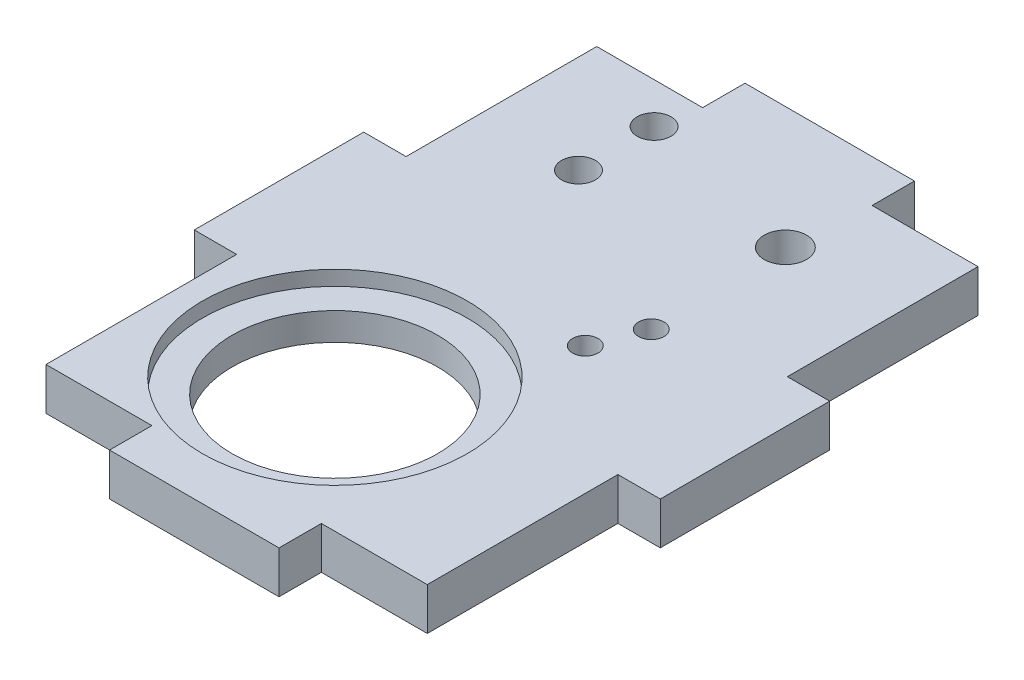
ISO-10303-21;
HEADER;
FILE_DESCRIPTION(('STEP AP214'),'2;1');
FILE_NAME('part.step','',(''),(''),'','','');
FILE_SCHEMA(('AUTOMOTIVE_DESIGN { 1 0 10303 214 1 1 1 1 }'));
ENDSEC;
DATA;
#1=APPLICATION_CONTEXT('core data for automotive mechanical design processes');
#2=APPLICATION_PROTOCOL_DEFINITION('international standard','automotive_design',2000,#1);
#3=PRODUCT_CONTEXT('',#1,'mechanical');
#4=PRODUCT('Part','Part','',(#3));
#5=PRODUCT_RELATED_PRODUCT_CATEGORY('part','',(#4));
#6=PRODUCT_DEFINITION_FORMATION('','',#4);
#7=PRODUCT_DEFINITION_CONTEXT('part definition',#1,'design');
#8=PRODUCT_DEFINITION('design','',#6,#7);
#9=PRODUCT_DEFINITION_SHAPE('','',#8);
#10=(LENGTH_UNIT() NAMED_UNIT(*) SI_UNIT(.MILLI.,.METRE.));
#11=(NAMED_UNIT(*) PLANE_ANGLE_UNIT() SI_UNIT($,.RADIAN.));
#12=(NAMED_UNIT(*) SI_UNIT($,.STERADIAN.) SOLID_ANGLE_UNIT());
#13=UNCERTAINTY_MEASURE_WITH_UNIT(LENGTH_MEASURE(1.E-05),#10,'distance_accuracy_value','');
#14=(GEOMETRIC_REPRESENTATION_CONTEXT(3) GLOBAL_UNCERTAINTY_ASSIGNED_CONTEXT((#13)) GLOBAL_UNIT_ASSIGNED_CONTEXT((#10,
#11,#12)) REPRESENTATION_CONTEXT('',''));
#15=CARTESIAN_POINT('',(0.,0.,0.));
#16=DIRECTION('',(0.,0.,1.));
#17=DIRECTION('',(1.,0.,0.));
#18=AXIS2_PLACEMENT_3D('',#15,#16,#17);
#19=CARTESIAN_POINT('',(0.,10.,0.));
#20=DIRECTION('',(-1.,0.,0.));
#21=DIRECTION('',(0.,0.,1.));
#22=AXIS2_PLACEMENT_3D('',#19,#20,#21);
#23=PLANE('',#22);
#24=DIRECTION('',(0.,0.,-1.));
#25=VECTOR('',#24,1.);
#26=CARTESIAN_POINT('',(0.,0.,0.));
#27=LINE('',#26,#25);
#28=CARTESIAN_POINT('',(0.,0.,0.));
#29=VERTEX_POINT('',#28);
#30=CARTESIAN_POINT('',(0.,0.,-45.));
#31=VERTEX_POINT('',#30);
#32=EDGE_CURVE('E195',#29,#31,#27,.T.);
#33=ORIENTED_EDGE('',*,*,#32,.F.);
#34=DIRECTION('',(0.,-1.,0.));
#35=VECTOR('',#34,1.);
#36=CARTESIAN_POINT('',(0.,10.,0.));
#37=LINE('',#36,#35);
#38=CARTESIAN_POINT('',(0.,10.,0.));
#39=VERTEX_POINT('',#38);
#40=EDGE_CURVE('E205',#39,#29,#37,.T.);
#41=ORIENTED_EDGE('',*,*,#40,.F.);
#42=DIRECTION('',(0.,0.,-1.));
#43=VECTOR('',#42,1.);
#44=CARTESIAN_POINT('',(0.,10.,0.));
#45=LINE('',#44,#43);
#46=CARTESIAN_POINT('',(0.,10.,-45.));
#47=VERTEX_POINT('',#46);
#48=EDGE_CURVE('E154',#39,#47,#45,.T.);
#49=ORIENTED_EDGE('',*,*,#48,.T.);
#50=DIRECTION('',(0.,-1.,0.));
#51=VECTOR('',#50,1.);
#52=CARTESIAN_POINT('',(0.,10.,-45.));
#53=LINE('',#52,#51);
#54=EDGE_CURVE('E208',#47,#31,#53,.T.);
#55=ORIENTED_EDGE('',*,*,#54,.T.);
#56=EDGE_LOOP('',(#33,#41,#49,#55));
#57=FACE_BOUND('',#56,.T.);
#58=ADVANCED_FACE('F41',(#57),#23,.T.);
#59=CARTESIAN_POINT('',(0.,10.,-45.));
#60=DIRECTION('',(0.,0.,1.));
#61=DIRECTION('',(1.,0.,0.));
#62=AXIS2_PLACEMENT_3D('',#59,#60,#61);
#63=PLANE('',#62);
#64=DIRECTION('',(-1.,0.,0.));
#65=VECTOR('',#64,1.);
#66=CARTESIAN_POINT('',(0.,0.,-45.));
#67=LINE('',#66,#65);
#68=CARTESIAN_POINT('',(-9.99999999999999,0.,-45.));
#69=VERTEX_POINT('',#68);
#70=EDGE_CURVE('E202',#31,#69,#67,.T.);
#71=ORIENTED_EDGE('',*,*,#70,.F.);
#72=ORIENTED_EDGE('',*,*,#54,.F.);
#73=DIRECTION('',(-1.,0.,0.));
#74=VECTOR('',#73,1.);
#75=CARTESIAN_POINT('',(0.,10.,-45.));
#76=LINE('',#75,#74);
#77=CARTESIAN_POINT('',(-9.99999999999999,10.,-45.));
#78=VERTEX_POINT('',#77);
#79=EDGE_CURVE('E161',#47,#78,#76,.T.);
#80=ORIENTED_EDGE('',*,*,#79,.T.);
#81=DIRECTION('',(0.,-1.,0.));
#82=VECTOR('',#81,1.);
#83=CARTESIAN_POINT('',(-9.99999999999999,10.,-45.));
#84=LINE('',#83,#82);
#85=EDGE_CURVE('E211',#78,#69,#84,.T.);
#86=ORIENTED_EDGE('',*,*,#85,.T.);
#87=EDGE_LOOP('',(#71,#72,#80,#86));
#88=FACE_BOUND('',#87,.T.);
#89=ADVANCED_FACE('F392',(#88),#63,.T.);
#90=CARTESIAN_POINT('',(-9.99999999999999,10.,0.));
#91=DIRECTION('',(1.,0.,0.));
#92=DIRECTION('',(0.,0.,-1.));
#93=AXIS2_PLACEMENT_3D('',#90,#91,#92);
#94=PLANE('',#93);
#95=DIRECTION('',(0.,0.,1.));
#96=VECTOR('',#95,1.);
#97=CARTESIAN_POINT('',(-9.99999999999999,0.,0.));
#98=LINE('',#97,#96);
#99=CARTESIAN_POINT('',(-9.99999999999999,0.,-85.));
#100=VERTEX_POINT('',#99);
#101=EDGE_CURVE('E198',#100,#69,#98,.T.);
#102=ORIENTED_EDGE('',*,*,#101,.T.);
#103=ORIENTED_EDGE('',*,*,#85,.F.);
#104=DIRECTION('',(0.,0.,1.));
#105=VECTOR('',#104,1.);
#106=CARTESIAN_POINT('',(-9.99999999999999,10.,0.));
#107=LINE('',#106,#105);
#108=CARTESIAN_POINT('',(-9.99999999999999,10.,-85.));
#109=VERTEX_POINT('',#108);
#110=EDGE_CURVE('E157',#109,#78,#107,.T.);
#111=ORIENTED_EDGE('',*,*,#110,.F.);
#112=DIRECTION('',(0.,-1.,0.));
#113=VECTOR('',#112,1.);
#114=CARTESIAN_POINT('',(-9.99999999999999,10.,-85.));
#115=LINE('',#114,#113);
#116=EDGE_CURVE('E214',#109,#100,#115,.T.);
#117=ORIENTED_EDGE('',*,*,#116,.T.);
#118=EDGE_LOOP('',(#102,#103,#111,#117));
#119=FACE_BOUND('',#118,.T.);
#120=ADVANCED_FACE('F399',(#119),#94,.F.);
#121=CARTESIAN_POINT('',(1.17961196366423E-13,10.,-85.));
#122=DIRECTION('',(0.,0.,1.));
#123=DIRECTION('',(1.,0.,0.));
#124=AXIS2_PLACEMENT_3D('',#121,#122,#123);
#125=PLANE('',#124);
#126=DIRECTION('',(-1.,0.,0.));
#127=VECTOR('',#126,1.);
#128=CARTESIAN_POINT('',(1.17961196366423E-13,0.,-85.));
#129=LINE('',#128,#127);
#130=CARTESIAN_POINT('',(0.,0.,-85.));
#131=VERTEX_POINT('',#130);
#132=EDGE_CURVE('E194',#131,#100,#129,.T.);
#133=ORIENTED_EDGE('',*,*,#132,.T.);
#134=ORIENTED_EDGE('',*,*,#116,.F.);
#135=DIRECTION('',(-1.,0.,0.));
#136=VECTOR('',#135,1.);
#137=CARTESIAN_POINT('',(1.17961196366423E-13,10.,-85.));
#138=LINE('',#137,#136);
#139=CARTESIAN_POINT('',(0.,10.,-85.));
#140=VERTEX_POINT('',#139);
#141=EDGE_CURVE('E153',#140,#109,#138,.T.);
#142=ORIENTED_EDGE('',*,*,#141,.F.);
#143=DIRECTION('',(0.,-1.,0.));
#144=VECTOR('',#143,1.);
#145=CARTESIAN_POINT('',(0.,10.,-85.));
#146=LINE('',#145,#144);
#147=EDGE_CURVE('E217',#140,#131,#146,.T.);
#148=ORIENTED_EDGE('',*,*,#147,.T.);
#149=EDGE_LOOP('',(#133,#134,#142,#148));
#150=FACE_BOUND('',#149,.T.);
#151=ADVANCED_FACE('F418',(#150),#125,.F.);
#152=CARTESIAN_POINT('',(1.17961196366423E-13,10.,-85.0000000000001));
#153=DIRECTION('',(0.,0.,-1.));
#154=DIRECTION('',(-1.,0.,0.));
#155=AXIS2_PLACEMENT_3D('',#152,#153,#154);
#156=PLANE('',#155);
#157=DIRECTION('',(1.,0.,0.));
#158=VECTOR('',#157,1.);
#159=CARTESIAN_POINT('',(1.17961196366423E-13,0.,-85.0000000000001));
#160=LINE('',#159,#158);
#161=CARTESIAN_POINT('',(90.,0.,-85.));
#162=VERTEX_POINT('',#161);
#163=CARTESIAN_POINT('',(100.,0.,-85.));
#164=VERTEX_POINT('',#163);
#165=EDGE_CURVE('E184',#162,#164,#160,.T.);
#166=ORIENTED_EDGE('',*,*,#165,.F.);
#167=DIRECTION('',(0.,-1.,0.));
#168=VECTOR('',#167,1.);
#169=CARTESIAN_POINT('',(90.,10.,-85.));
#170=LINE('',#169,#168);
#171=CARTESIAN_POINT('',(90.,10.,-85.));
#172=VERTEX_POINT('',#171);
#173=EDGE_CURVE('E225',#172,#162,#170,.T.);
#174=ORIENTED_EDGE('',*,*,#173,.F.);
#175=DIRECTION('',(1.,0.,0.));
#176=VECTOR('',#175,1.);
#177=CARTESIAN_POINT('',(1.17961196366423E-13,10.,-85.0000000000001));
#178=LINE('',#177,#176);
#179=CARTESIAN_POINT('',(100.,10.,-85.));
#180=VERTEX_POINT('',#179);
#181=EDGE_CURVE('E145',#172,#180,#178,.T.);
#182=ORIENTED_EDGE('',*,*,#181,.T.);
#183=DIRECTION('',(0.,-1.,0.));
#184=VECTOR('',#183,1.);
#185=CARTESIAN_POINT('',(100.,10.,-85.));
#186=LINE('',#185,#184);
#187=EDGE_CURVE('E229',#180,#164,#186,.T.);
#188=ORIENTED_EDGE('',*,*,#187,.T.);
#189=EDGE_LOOP('',(#166,#174,#182,#188));
#190=FACE_BOUND('',#189,.T.);
#191=ADVANCED_FACE('F310',(#190),#156,.T.);
#192=CARTESIAN_POINT('',(100.,10.,0.));
#193=DIRECTION('',(1.,0.,0.));
#194=DIRECTION('',(0.,0.,-1.));
#195=AXIS2_PLACEMENT_3D('',#192,#193,#194);
#196=PLANE('',#195);
#197=DIRECTION('',(0.,0.,1.));
#198=VECTOR('',#197,1.);
#199=CARTESIAN_POINT('',(100.,0.,0.));
#200=LINE('',#199,#198);
#201=CARTESIAN_POINT('',(100.,0.,-45.));
#202=VERTEX_POINT('',#201);
#203=EDGE_CURVE('E181',#164,#202,#200,.T.);
#204=ORIENTED_EDGE('',*,*,#203,.F.);
#205=ORIENTED_EDGE('',*,*,#187,.F.);
#206=DIRECTION('',(0.,0.,1.));
#207=VECTOR('',#206,1.);
#208=CARTESIAN_POINT('',(100.,10.,0.));
#209=LINE('',#208,#207);
#210=CARTESIAN_POINT('',(100.,10.,-45.));
#211=VERTEX_POINT('',#210);
#212=EDGE_CURVE('E291',#180,#211,#209,.T.);
#213=ORIENTED_EDGE('',*,*,#212,.T.);
#214=DIRECTION('',(0.,-1.,0.));
#215=VECTOR('',#214,1.);
#216=CARTESIAN_POINT('',(100.,10.,-45.));
#217=LINE('',#216,#215);
#218=EDGE_CURVE('E233',#211,#202,#217,.T.);
#219=ORIENTED_EDGE('',*,*,#218,.T.);
#220=EDGE_LOOP('',(#204,#205,#213,#219));
#221=FACE_BOUND('',#220,.T.);
#222=ADVANCED_FACE('F373',(#221),#196,.T.);
#223=CARTESIAN_POINT('',(0.,10.,-45.));
#224=DIRECTION('',(0.,0.,-1.));
#225=DIRECTION('',(-1.,0.,0.));
#226=AXIS2_PLACEMENT_3D('',#223,#224,#225);
#227=PLANE('',#226);
#228=DIRECTION('',(1.,0.,0.));
#229=VECTOR('',#228,1.);
#230=CARTESIAN_POINT('',(0.,0.,-45.));
#231=LINE('',#230,#229);
#232=CARTESIAN_POINT('',(90.,0.,-45.));
#233=VERTEX_POINT('',#232);
#234=EDGE_CURVE('E177',#233,#202,#231,.T.);
#235=ORIENTED_EDGE('',*,*,#234,.T.);
#236=ORIENTED_EDGE('',*,*,#218,.F.);
#237=DIRECTION('',(1.,0.,0.));
#238=VECTOR('',#237,1.);
#239=CARTESIAN_POINT('',(0.,10.,-45.));
#240=LINE('',#239,#238);
#241=CARTESIAN_POINT('',(90.,10.,-45.));
#242=VERTEX_POINT('',#241);
#243=EDGE_CURVE('E289',#242,#211,#240,.T.);
#244=ORIENTED_EDGE('',*,*,#243,.F.);
#245=DIRECTION('',(0.,-1.,0.));
#246=VECTOR('',#245,1.);
#247=CARTESIAN_POINT('',(90.,10.,-45.));
#248=LINE('',#247,#246);
#249=EDGE_CURVE('E236',#242,#233,#248,.T.);
#250=ORIENTED_EDGE('',*,*,#249,.T.);
#251=EDGE_LOOP('',(#235,#236,#244,#250));
#252=FACE_BOUND('',#251,.T.);
#253=ADVANCED_FACE('F372',(#252),#227,.F.);
#254=CARTESIAN_POINT('',(90.,10.,0.));
#255=DIRECTION('',(-1.,0.,0.));
#256=DIRECTION('',(0.,0.,1.));
#257=AXIS2_PLACEMENT_3D('',#254,#255,#256);
#258=PLANE('',#257);
#259=DIRECTION('',(0.,0.,-1.));
#260=VECTOR('',#259,1.);
#261=CARTESIAN_POINT('',(90.,0.,0.));
#262=LINE('',#261,#260);
#263=CARTESIAN_POINT('',(90.,0.,0.));
#264=VERTEX_POINT('',#263);
#265=EDGE_CURVE('E174',#264,#233,#262,.T.);
#266=ORIENTED_EDGE('',*,*,#265,.T.);
#267=ORIENTED_EDGE('',*,*,#249,.F.);
#268=DIRECTION('',(0.,0.,-1.));
#269=VECTOR('',#268,1.);
#270=CARTESIAN_POINT('',(90.,10.,0.));
#271=LINE('',#270,#269);
#272=CARTESIAN_POINT('',(90.,10.,0.));
#273=VERTEX_POINT('',#272);
#274=EDGE_CURVE('E147',#273,#242,#271,.T.);
#275=ORIENTED_EDGE('',*,*,#274,.F.);
#276=DIRECTION('',(0.,-1.,0.));
#277=VECTOR('',#276,1.);
#278=CARTESIAN_POINT('',(90.,10.,0.));
#279=LINE('',#278,#277);
#280=EDGE_CURVE('E239',#273,#264,#279,.T.);
#281=ORIENTED_EDGE('',*,*,#280,.T.);
#282=EDGE_LOOP('',(#266,#267,#275,#281));
#283=FACE_BOUND('',#282,.T.);
#284=ADVANCED_FACE('F280',(#283),#258,.F.);
#285=CARTESIAN_POINT('',(0.,10.,0.));
#286=DIRECTION('',(0.,0.,-1.));
#287=DIRECTION('',(-1.,0.,0.));
#288=AXIS2_PLACEMENT_3D('',#285,#286,#287);
#289=PLANE('',#288);
#290=DIRECTION('',(1.,0.,0.));
#291=VECTOR('',#290,1.);
#292=CARTESIAN_POINT('',(0.,0.,0.));
#293=LINE('',#292,#291);
#294=CARTESIAN_POINT('',(65.,0.,0.));
#295=VERTEX_POINT('',#294);
#296=EDGE_CURVE('E166',#295,#264,#293,.T.);
#297=ORIENTED_EDGE('',*,*,#296,.T.);
#298=ORIENTED_EDGE('',*,*,#280,.F.);
#299=DIRECTION('',(1.,0.,0.));
#300=VECTOR('',#299,1.);
#301=CARTESIAN_POINT('',(0.,10.,0.));
#302=LINE('',#301,#300);
#303=CARTESIAN_POINT('',(65.,10.,0.));
#304=VERTEX_POINT('',#303);
#305=EDGE_CURVE('E290',#304,#273,#302,.T.);
#306=ORIENTED_EDGE('',*,*,#305,.F.);
#307=DIRECTION('',(0.,-1.,0.));
#308=VECTOR('',#307,1.);
#309=CARTESIAN_POINT('',(65.,10.,0.));
#310=LINE('',#309,#308);
#311=EDGE_CURVE('E242',#304,#295,#310,.T.);
#312=ORIENTED_EDGE('',*,*,#311,.T.);
#313=EDGE_LOOP('',(#297,#298,#306,#312));
#314=FACE_BOUND('',#313,.T.);
#315=ADVANCED_FACE('F273',(#314),#289,.F.);
#316=CARTESIAN_POINT('',(65.,10.,0.));
#317=DIRECTION('',(1.,0.,0.));
#318=DIRECTION('',(0.,0.,-1.));
#319=AXIS2_PLACEMENT_3D('',#316,#317,#318);
#320=PLANE('',#319);
#321=DIRECTION('',(0.,0.,1.));
#322=VECTOR('',#321,1.);
#323=CARTESIAN_POINT('',(65.,0.,0.));
#324=LINE('',#323,#322);
#325=CARTESIAN_POINT('',(65.,0.,10.));
#326=VERTEX_POINT('',#325);
#327=EDGE_CURVE('E171',#295,#326,#324,.T.);
#328=ORIENTED_EDGE('',*,*,#327,.F.);
#329=ORIENTED_EDGE('',*,*,#311,.F.);
#330=DIRECTION('',(0.,0.,1.));
#331=VECTOR('',#330,1.);
#332=CARTESIAN_POINT('',(65.,10.,0.));
#333=LINE('',#332,#331);
#334=CARTESIAN_POINT('',(65.,10.,10.));
#335=VERTEX_POINT('',#334);
#336=EDGE_CURVE('E256',#304,#335,#333,.T.);
#337=ORIENTED_EDGE('',*,*,#336,.T.);
#338=DIRECTION('',(0.,-1.,0.));
#339=VECTOR('',#338,1.);
#340=CARTESIAN_POINT('',(65.,10.,10.));
#341=LINE('',#340,#339);
#342=EDGE_CURVE('E122',#335,#326,#341,.T.);
#343=ORIENTED_EDGE('',*,*,#342,.T.);
#344=EDGE_LOOP('',(#328,#329,#337,#343));
#345=FACE_BOUND('',#344,.T.);
#346=ADVANCED_FACE('F251',(#345),#320,.T.);
#347=CARTESIAN_POINT('',(0.,10.,10.));
#348=DIRECTION('',(0.,0.,1.));
#349=DIRECTION('',(1.,0.,0.));
#350=AXIS2_PLACEMENT_3D('',#347,#348,#349);
#351=PLANE('',#350);
#352=DIRECTION('',(-1.,0.,0.));
#353=VECTOR('',#352,1.);
#354=CARTESIAN_POINT('',(0.,0.,10.));
#355=LINE('',#354,#353);
#356=CARTESIAN_POINT('',(25.,0.,10.));
#357=VERTEX_POINT('',#356);
#358=EDGE_CURVE('E168',#326,#357,#355,.T.);
#359=ORIENTED_EDGE('',*,*,#358,.F.);
#360=ORIENTED_EDGE('',*,*,#342,.F.);
#361=DIRECTION('',(-1.,0.,0.));
#362=VECTOR('',#361,1.);
#363=CARTESIAN_POINT('',(0.,10.,10.));
#364=LINE('',#363,#362);
#365=CARTESIAN_POINT('',(25.,10.,10.));
#366=VERTEX_POINT('',#365);
#367=EDGE_CURVE('E473',#335,#366,#364,.T.);
#368=ORIENTED_EDGE('',*,*,#367,.T.);
#369=DIRECTION('',(0.,-1.,0.));
#370=VECTOR('',#369,1.);
#371=CARTESIAN_POINT('',(25.,10.,10.));
#372=LINE('',#371,#370);
#373=EDGE_CURVE('E114',#366,#357,#372,.T.);
#374=ORIENTED_EDGE('',*,*,#373,.T.);
#375=EDGE_LOOP('',(#359,#360,#368,#374));
#376=FACE_BOUND('',#375,.T.);
#377=ADVANCED_FACE('F262',(#376),#351,.T.);
#378=CARTESIAN_POINT('',(25.,10.,0.));
#379=DIRECTION('',(1.,0.,0.));
#380=DIRECTION('',(0.,0.,-1.));
#381=AXIS2_PLACEMENT_3D('',#378,#379,#380);
#382=PLANE('',#381);
#383=DIRECTION('',(0.,0.,1.));
#384=VECTOR('',#383,1.);
#385=CARTESIAN_POINT('',(25.,0.,0.));
#386=LINE('',#385,#384);
#387=CARTESIAN_POINT('',(25.,0.,0.));
#388=VERTEX_POINT('',#387);
#389=EDGE_CURVE('E165',#388,#357,#386,.T.);
#390=ORIENTED_EDGE('',*,*,#389,.T.);
#391=ORIENTED_EDGE('',*,*,#373,.F.);
#392=DIRECTION('',(0.,0.,1.));
#393=VECTOR('',#392,1.);
#394=CARTESIAN_POINT('',(25.,10.,0.));
#395=LINE('',#394,#393);
#396=CARTESIAN_POINT('',(25.,10.,0.));
#397=VERTEX_POINT('',#396);
#398=EDGE_CURVE('E365',#397,#366,#395,.T.);
#399=ORIENTED_EDGE('',*,*,#398,.F.);
#400=DIRECTION('',(0.,-1.,0.));
#401=VECTOR('',#400,1.);
#402=CARTESIAN_POINT('',(25.,10.,0.));
#403=LINE('',#402,#401);
#404=EDGE_CURVE('E108',#397,#388,#403,.T.);
#405=ORIENTED_EDGE('',*,*,#404,.T.);
#406=EDGE_LOOP('',(#390,#391,#399,#405));
#407=FACE_BOUND('',#406,.T.);
#408=ADVANCED_FACE('F474',(#407),#382,.F.);
#409=EDGE_CURVE('E90',#29,#388,#293,.T.);
#410=ORIENTED_EDGE('',*,*,#409,.T.);
#411=ORIENTED_EDGE('',*,*,#404,.F.);
#412=EDGE_CURVE('E294',#39,#397,#302,.T.);
#413=ORIENTED_EDGE('',*,*,#412,.F.);
#414=ORIENTED_EDGE('',*,*,#40,.T.);
#415=EDGE_LOOP('',(#410,#411,#413,#414));
#416=FACE_BOUND('',#415,.T.);
#417=ADVANCED_FACE('F411',(#416),#289,.F.);
#418=CARTESIAN_POINT('',(90.,0.,-130.));
#419=VERTEX_POINT('',#418);
#420=EDGE_CURVE('E178',#162,#419,#262,.T.);
#421=ORIENTED_EDGE('',*,*,#420,.T.);
#422=DIRECTION('',(0.,-1.,0.));
#423=VECTOR('',#422,1.);
#424=CARTESIAN_POINT('',(90.,10.,-130.));
#425=LINE('',#424,#423);
#426=CARTESIAN_POINT('',(90.,10.,-130.));
#427=VERTEX_POINT('',#426);
#428=EDGE_CURVE('E223',#427,#419,#425,.T.);
#429=ORIENTED_EDGE('',*,*,#428,.F.);
#430=EDGE_CURVE('E138',#172,#427,#271,.T.);
#431=ORIENTED_EDGE('',*,*,#430,.F.);
#432=ORIENTED_EDGE('',*,*,#173,.T.);
#433=EDGE_LOOP('',(#421,#429,#431,#432));
#434=FACE_BOUND('',#433,.T.);
#435=ADVANCED_FACE('F378',(#434),#258,.F.);
#436=CARTESIAN_POINT('',(0.,0.,-130.));
#437=VERTEX_POINT('',#436);
#438=EDGE_CURVE('E190',#131,#437,#27,.T.);
#439=ORIENTED_EDGE('',*,*,#438,.F.);
#440=ORIENTED_EDGE('',*,*,#147,.F.);
#441=CARTESIAN_POINT('',(0.,10.,-130.));
#442=VERTEX_POINT('',#441);
#443=EDGE_CURVE('E143',#140,#442,#45,.T.);
#444=ORIENTED_EDGE('',*,*,#443,.T.);
#445=DIRECTION('',(0.,-1.,0.));
#446=VECTOR('',#445,1.);
#447=CARTESIAN_POINT('',(0.,10.,-130.));
#448=LINE('',#447,#446);
#449=EDGE_CURVE('E220',#442,#437,#448,.T.);
#450=ORIENTED_EDGE('',*,*,#449,.T.);
#451=EDGE_LOOP('',(#439,#440,#444,#450));
#452=FACE_BOUND('',#451,.T.);
#453=ADVANCED_FACE('F395',(#452),#23,.T.);
#454=CARTESIAN_POINT('',(0.,0.,0.));
#455=DIRECTION('',(0.,1.,0.));
#456=DIRECTION('',(0.,0.,1.));
#457=AXIS2_PLACEMENT_3D('',#454,#455,#456);
#458=PLANE('',#457);
#459=CARTESIAN_POINT('',(63.314917682602,0.,-111.209559187664));
#460=DIRECTION('',(0.,1.,0.));
#461=DIRECTION('',(0.,0.,1.));
#462=AXIS2_PLACEMENT_3D('',#459,#460,#461);
#463=CIRCLE('',#462,5.00000000000001);
#464=CARTESIAN_POINT('',(63.314917682602,0.,-106.209559187664));
#465=VERTEX_POINT('',#464);
#466=EDGE_CURVE('E436',#465,#465,#463,.T.);
#467=ORIENTED_EDGE('',*,*,#466,.T.);
#468=EDGE_LOOP('',(#467));
#469=FACE_BOUND('',#468,.T.);
#470=CARTESIAN_POINT('',(36.72,0.,-31.47));
#471=DIRECTION('',(0.,1.,0.));
#472=DIRECTION('',(0.,0.,1.));
#473=AXIS2_PLACEMENT_3D('',#470,#471,#472);
#474=CIRCLE('',#473,24.25);
#475=CARTESIAN_POINT('',(36.72,0.,-7.21999999999998));
#476=VERTEX_POINT('',#475);
#477=EDGE_CURVE('E435',#476,#476,#474,.T.);
#478=ORIENTED_EDGE('',*,*,#477,.T.);
#479=EDGE_LOOP('',(#478));
#480=FACE_BOUND('',#479,.T.);
#481=CARTESIAN_POINT('',(64.2471009673165,0.,-78.6365210319121));
#482=DIRECTION('',(0.,1.,0.));
#483=DIRECTION('',(0.,0.,1.));
#484=AXIS2_PLACEMENT_3D('',#481,#482,#483);
#485=CIRCLE('',#484,3.00000000000001);
#486=CARTESIAN_POINT('',(64.2471009673165,0.,-75.6365210319121));
#487=VERTEX_POINT('',#486);
#488=EDGE_CURVE('E441',#487,#487,#485,.T.);
#489=ORIENTED_EDGE('',*,*,#488,.T.);
#490=EDGE_LOOP('',(#489));
#491=FACE_BOUND('',#490,.T.);
#492=CARTESIAN_POINT('',(59.8275943812254,0.,-67.48));
#493=DIRECTION('',(0.,1.,0.));
#494=DIRECTION('',(0.,0.,1.));
#495=AXIS2_PLACEMENT_3D('',#492,#493,#494);
#496=CIRCLE('',#495,3.00000000000001);
#497=CARTESIAN_POINT('',(59.8275943812254,0.,-64.48));
#498=VERTEX_POINT('',#497);
#499=EDGE_CURVE('E454',#498,#498,#496,.T.);
#500=ORIENTED_EDGE('',*,*,#499,.T.);
#501=EDGE_LOOP('',(#500));
#502=FACE_BOUND('',#501,.T.);
#503=CARTESIAN_POINT('',(23.122776972393,0.,-102.57));
#504=DIRECTION('',(0.,1.,0.));
#505=DIRECTION('',(0.,0.,1.));
#506=AXIS2_PLACEMENT_3D('',#503,#504,#505);
#507=CIRCLE('',#506,4.);
#508=CARTESIAN_POINT('',(23.122776972393,0.,-98.57));
#509=VERTEX_POINT('',#508);
#510=EDGE_CURVE('E103',#509,#509,#507,.T.);
#511=ORIENTED_EDGE('',*,*,#510,.T.);
#512=EDGE_LOOP('',(#511));
#513=FACE_BOUND('',#512,.T.);
#514=CARTESIAN_POINT('',(23.122776972393,0.,-120.41));
#515=DIRECTION('',(0.,1.,0.));
#516=DIRECTION('',(0.,0.,1.));
#517=AXIS2_PLACEMENT_3D('',#514,#515,#516);
#518=CIRCLE('',#517,4.);
#519=CARTESIAN_POINT('',(23.122776972393,0.,-116.41));
#520=VERTEX_POINT('',#519);
#521=EDGE_CURVE('E450',#520,#520,#518,.T.);
#522=ORIENTED_EDGE('',*,*,#521,.T.);
#523=EDGE_LOOP('',(#522));
#524=FACE_BOUND('',#523,.T.);
#525=ORIENTED_EDGE('',*,*,#409,.F.);
#526=ORIENTED_EDGE('',*,*,#32,.T.);
#527=ORIENTED_EDGE('',*,*,#70,.T.);
#528=ORIENTED_EDGE('',*,*,#101,.F.);
#529=ORIENTED_EDGE('',*,*,#132,.F.);
#530=ORIENTED_EDGE('',*,*,#438,.T.);
#531=DIRECTION('',(1.,0.,0.));
#532=VECTOR('',#531,1.);
#533=CARTESIAN_POINT('',(0.,0.,-130.));
#534=LINE('',#533,#532);
#535=CARTESIAN_POINT('',(25.,0.,-130.));
#536=VERTEX_POINT('',#535);
#537=EDGE_CURVE('E187',#437,#536,#534,.T.);
#538=ORIENTED_EDGE('',*,*,#537,.T.);
#539=DIRECTION('',(0.,0.,-1.));
#540=VECTOR('',#539,1.);
#541=CARTESIAN_POINT('',(25.,0.,-130.));
#542=LINE('',#541,#540);
#543=CARTESIAN_POINT('',(25.,0.,-140.));
#544=VERTEX_POINT('',#543);
#545=EDGE_CURVE('E101',#536,#544,#542,.T.);
#546=ORIENTED_EDGE('',*,*,#545,.T.);
#547=DIRECTION('',(1.,0.,0.));
#548=VECTOR('',#547,1.);
#549=CARTESIAN_POINT('',(25.,0.,-140.));
#550=LINE('',#549,#548);
#551=CARTESIAN_POINT('',(65.,0.,-140.));
#552=VERTEX_POINT('',#551);
#553=EDGE_CURVE('E85',#544,#552,#550,.T.);
#554=ORIENTED_EDGE('',*,*,#553,.T.);
#555=DIRECTION('',(0.,0.,-1.));
#556=VECTOR('',#555,1.);
#557=CARTESIAN_POINT('',(65.,0.,-130.));
#558=LINE('',#557,#556);
#559=CARTESIAN_POINT('',(65.,0.,-130.));
#560=VERTEX_POINT('',#559);
#561=EDGE_CURVE('E92',#560,#552,#558,.T.);
#562=ORIENTED_EDGE('',*,*,#561,.F.);
#563=EDGE_CURVE('E191',#560,#419,#534,.T.);
#564=ORIENTED_EDGE('',*,*,#563,.T.);
#565=ORIENTED_EDGE('',*,*,#420,.F.);
#566=ORIENTED_EDGE('',*,*,#165,.T.);
#567=ORIENTED_EDGE('',*,*,#203,.T.);
#568=ORIENTED_EDGE('',*,*,#234,.F.);
#569=ORIENTED_EDGE('',*,*,#265,.F.);
#570=ORIENTED_EDGE('',*,*,#296,.F.);
#571=ORIENTED_EDGE('',*,*,#327,.T.);
#572=ORIENTED_EDGE('',*,*,#358,.T.);
#573=ORIENTED_EDGE('',*,*,#389,.F.);
#574=EDGE_LOOP('',(#525,#526,#527,#528,#529,#530,#538,#546,#554,#562,#564,#565,#566,#567,#568,
#569,#570,#571,#572,#573));
#575=FACE_BOUND('',#574,.T.);
#576=ADVANCED_FACE('F99',(#469,#480,#491,#502,#513,#524,#575),#458,.F.);
#577=CARTESIAN_POINT('',(0.,10.,0.));
#578=DIRECTION('',(0.,1.,0.));
#579=DIRECTION('',(0.,0.,1.));
#580=AXIS2_PLACEMENT_3D('',#577,#578,#579);
#581=PLANE('',#580);
#582=CARTESIAN_POINT('',(63.314917682602,10.,-111.209559187664));
#583=DIRECTION('',(0.,1.,0.));
#584=DIRECTION('',(0.,0.,1.));
#585=AXIS2_PLACEMENT_3D('',#582,#583,#584);
#586=CIRCLE('',#585,5.00000000000001);
#587=CARTESIAN_POINT('',(63.314917682602,10.,-106.209559187664));
#588=VERTEX_POINT('',#587);
#589=EDGE_CURVE('E692',#588,#588,#586,.T.);
#590=ORIENTED_EDGE('',*,*,#589,.F.);
#591=EDGE_LOOP('',(#590));
#592=FACE_BOUND('',#591,.T.);
#593=CARTESIAN_POINT('',(36.72,10.,-31.47));
#594=DIRECTION('',(0.,1.,0.));
#595=DIRECTION('',(0.,0.,1.));
#596=AXIS2_PLACEMENT_3D('',#593,#594,#595);
#597=CIRCLE('',#596,31.25);
#598=CARTESIAN_POINT('',(36.72,10.,-0.219999999999984));
#599=VERTEX_POINT('',#598);
#600=EDGE_CURVE('E439',#599,#599,#597,.T.);
#601=ORIENTED_EDGE('',*,*,#600,.F.);
#602=EDGE_LOOP('',(#601));
#603=FACE_BOUND('',#602,.T.);
#604=CARTESIAN_POINT('',(64.2471009673165,10.,-78.6365210319121));
#605=DIRECTION('',(0.,1.,0.));
#606=DIRECTION('',(0.,0.,1.));
#607=AXIS2_PLACEMENT_3D('',#604,#605,#606);
#608=CIRCLE('',#607,3.00000000000001);
#609=CARTESIAN_POINT('',(64.2471009673165,10.,-75.6365210319121));
#610=VERTEX_POINT('',#609);
#611=EDGE_CURVE('E444',#610,#610,#608,.T.);
#612=ORIENTED_EDGE('',*,*,#611,.F.);
#613=EDGE_LOOP('',(#612));
#614=FACE_BOUND('',#613,.T.);
#615=CARTESIAN_POINT('',(59.8275943812254,10.,-67.48));
#616=DIRECTION('',(0.,1.,0.));
#617=DIRECTION('',(0.,0.,1.));
#618=AXIS2_PLACEMENT_3D('',#615,#616,#617);
#619=CIRCLE('',#618,3.00000000000001);
#620=CARTESIAN_POINT('',(59.8275943812254,10.,-64.48));
#621=VERTEX_POINT('',#620);
#622=EDGE_CURVE('E461',#621,#621,#619,.T.);
#623=ORIENTED_EDGE('',*,*,#622,.F.);
#624=EDGE_LOOP('',(#623));
#625=FACE_BOUND('',#624,.T.);
#626=CARTESIAN_POINT('',(23.122776972393,10.,-102.57));
#627=DIRECTION('',(0.,1.,0.));
#628=DIRECTION('',(0.,0.,1.));
#629=AXIS2_PLACEMENT_3D('',#626,#627,#628);
#630=CIRCLE('',#629,4.);
#631=CARTESIAN_POINT('',(23.122776972393,10.,-98.57));
#632=VERTEX_POINT('',#631);
#633=EDGE_CURVE('E467',#632,#632,#630,.T.);
#634=ORIENTED_EDGE('',*,*,#633,.F.);
#635=EDGE_LOOP('',(#634));
#636=FACE_BOUND('',#635,.T.);
#637=CARTESIAN_POINT('',(23.122776972393,10.,-120.41));
#638=DIRECTION('',(0.,1.,0.));
#639=DIRECTION('',(0.,0.,1.));
#640=AXIS2_PLACEMENT_3D('',#637,#638,#639);
#641=CIRCLE('',#640,4.);
#642=CARTESIAN_POINT('',(23.122776972393,10.,-116.41));
#643=VERTEX_POINT('',#642);
#644=EDGE_CURVE('E443',#643,#643,#641,.T.);
#645=ORIENTED_EDGE('',*,*,#644,.F.);
#646=EDGE_LOOP('',(#645));
#647=FACE_BOUND('',#646,.T.);
#648=ORIENTED_EDGE('',*,*,#412,.T.);
#649=ORIENTED_EDGE('',*,*,#398,.T.);
#650=ORIENTED_EDGE('',*,*,#367,.F.);
#651=ORIENTED_EDGE('',*,*,#336,.F.);
#652=ORIENTED_EDGE('',*,*,#305,.T.);
#653=ORIENTED_EDGE('',*,*,#274,.T.);
#654=ORIENTED_EDGE('',*,*,#243,.T.);
#655=ORIENTED_EDGE('',*,*,#212,.F.);
#656=ORIENTED_EDGE('',*,*,#181,.F.);
#657=ORIENTED_EDGE('',*,*,#430,.T.);
#658=DIRECTION('',(1.,0.,0.));
#659=VECTOR('',#658,1.);
#660=CARTESIAN_POINT('',(0.,10.,-130.));
#661=LINE('',#660,#659);
#662=CARTESIAN_POINT('',(65.,10.,-130.));
#663=VERTEX_POINT('',#662);
#664=EDGE_CURVE('E134',#663,#427,#661,.T.);
#665=ORIENTED_EDGE('',*,*,#664,.F.);
#666=DIRECTION('',(0.,0.,-1.));
#667=VECTOR('',#666,1.);
#668=CARTESIAN_POINT('',(65.,10.,-130.));
#669=LINE('',#668,#667);
#670=CARTESIAN_POINT('',(65.,10.,-140.));
#671=VERTEX_POINT('',#670);
#672=EDGE_CURVE('E127',#663,#671,#669,.T.);
#673=ORIENTED_EDGE('',*,*,#672,.T.);
#674=DIRECTION('',(1.,0.,0.));
#675=VECTOR('',#674,1.);
#676=CARTESIAN_POINT('',(25.,10.,-140.));
#677=LINE('',#676,#675);
#678=CARTESIAN_POINT('',(25.,10.,-140.));
#679=VERTEX_POINT('',#678);
#680=EDGE_CURVE('E88',#679,#671,#677,.T.);
#681=ORIENTED_EDGE('',*,*,#680,.F.);
#682=DIRECTION('',(0.,0.,-1.));
#683=VECTOR('',#682,1.);
#684=CARTESIAN_POINT('',(25.,10.,-130.));
#685=LINE('',#684,#683);
#686=CARTESIAN_POINT('',(25.,10.,-130.));
#687=VERTEX_POINT('',#686);
#688=EDGE_CURVE('E96',#687,#679,#685,.T.);
#689=ORIENTED_EDGE('',*,*,#688,.F.);
#690=EDGE_CURVE('E141',#442,#687,#661,.T.);
#691=ORIENTED_EDGE('',*,*,#690,.F.);
#692=ORIENTED_EDGE('',*,*,#443,.F.);
#693=ORIENTED_EDGE('',*,*,#141,.T.);
#694=ORIENTED_EDGE('',*,*,#110,.T.);
#695=ORIENTED_EDGE('',*,*,#79,.F.);
#696=ORIENTED_EDGE('',*,*,#48,.F.);
#697=EDGE_LOOP('',(#648,#649,#650,#651,#652,#653,#654,#655,#656,#657,#665,#673,#681,#689,#691,
#692,#693,#694,#695,#696));
#698=FACE_BOUND('',#697,.T.);
#699=ADVANCED_FACE('F131',(#592,#603,#614,#625,#636,#647,#698),#581,.T.);
#700=CARTESIAN_POINT('',(0.,10.,-130.));
#701=DIRECTION('',(0.,0.,-1.));
#702=DIRECTION('',(-1.,0.,0.));
#703=AXIS2_PLACEMENT_3D('',#700,#701,#702);
#704=PLANE('',#703);
#705=ORIENTED_EDGE('',*,*,#690,.T.);
#706=DIRECTION('',(0.,-1.,0.));
#707=VECTOR('',#706,1.);
#708=CARTESIAN_POINT('',(25.,10.,-130.));
#709=LINE('',#708,#707);
#710=EDGE_CURVE('E51',#687,#536,#709,.T.);
#711=ORIENTED_EDGE('',*,*,#710,.T.);
#712=ORIENTED_EDGE('',*,*,#537,.F.);
#713=ORIENTED_EDGE('',*,*,#449,.F.);
#714=EDGE_LOOP('',(#705,#711,#712,#713));
#715=FACE_BOUND('',#714,.T.);
#716=ADVANCED_FACE('F381',(#715),#704,.T.);
#717=DIRECTION('',(0.,-1.,0.));
#718=VECTOR('',#717,1.);
#719=CARTESIAN_POINT('',(65.,10.,-130.));
#720=LINE('',#719,#718);
#721=EDGE_CURVE('E11',#663,#560,#720,.T.);
#722=ORIENTED_EDGE('',*,*,#721,.F.);
#723=ORIENTED_EDGE('',*,*,#664,.T.);
#724=ORIENTED_EDGE('',*,*,#428,.T.);
#725=ORIENTED_EDGE('',*,*,#563,.F.);
#726=EDGE_LOOP('',(#722,#723,#724,#725));
#727=FACE_BOUND('',#726,.T.);
#728=ADVANCED_FACE('F379',(#727),#704,.T.);
#729=CARTESIAN_POINT('',(25.,10.,-140.));
#730=DIRECTION('',(0.,0.,-1.));
#731=DIRECTION('',(-1.,0.,0.));
#732=AXIS2_PLACEMENT_3D('',#729,#730,#731);
#733=PLANE('',#732);
#734=ORIENTED_EDGE('',*,*,#553,.F.);
#735=DIRECTION('',(0.,-1.,0.));
#736=VECTOR('',#735,1.);
#737=CARTESIAN_POINT('',(25.,10.,-140.));
#738=LINE('',#737,#736);
#739=EDGE_CURVE('E45',#679,#544,#738,.T.);
#740=ORIENTED_EDGE('',*,*,#739,.F.);
#741=ORIENTED_EDGE('',*,*,#680,.T.);
#742=DIRECTION('',(0.,-1.,0.));
#743=VECTOR('',#742,1.);
#744=CARTESIAN_POINT('',(65.,10.,-140.));
#745=LINE('',#744,#743);
#746=EDGE_CURVE('E81',#671,#552,#745,.T.);
#747=ORIENTED_EDGE('',*,*,#746,.T.);
#748=EDGE_LOOP('',(#734,#740,#741,#747));
#749=FACE_BOUND('',#748,.T.);
#750=ADVANCED_FACE('F83',(#749),#733,.T.);
#751=CARTESIAN_POINT('',(25.,10.,-130.));
#752=DIRECTION('',(-1.,0.,0.));
#753=DIRECTION('',(0.,0.,1.));
#754=AXIS2_PLACEMENT_3D('',#751,#752,#753);
#755=PLANE('',#754);
#756=ORIENTED_EDGE('',*,*,#545,.F.);
#757=ORIENTED_EDGE('',*,*,#710,.F.);
#758=ORIENTED_EDGE('',*,*,#688,.T.);
#759=ORIENTED_EDGE('',*,*,#739,.T.);
#760=EDGE_LOOP('',(#756,#757,#758,#759));
#761=FACE_BOUND('',#760,.T.);
#762=ADVANCED_FACE('F43',(#761),#755,.T.);
#763=CARTESIAN_POINT('',(65.,10.,-130.));
#764=DIRECTION('',(-1.,0.,0.));
#765=DIRECTION('',(0.,0.,1.));
#766=AXIS2_PLACEMENT_3D('',#763,#764,#765);
#767=PLANE('',#766);
#768=ORIENTED_EDGE('',*,*,#561,.T.);
#769=ORIENTED_EDGE('',*,*,#746,.F.);
#770=ORIENTED_EDGE('',*,*,#672,.F.);
#771=ORIENTED_EDGE('',*,*,#721,.T.);
#772=EDGE_LOOP('',(#768,#769,#770,#771));
#773=FACE_BOUND('',#772,.T.);
#774=ADVANCED_FACE('F93',(#773),#767,.F.);
#775=CARTESIAN_POINT('',(23.122776972393,0.,-120.41));
#776=DIRECTION('',(0.,1.,0.));
#777=DIRECTION('',(0.,0.,1.));
#778=AXIS2_PLACEMENT_3D('',#775,#776,#777);
#779=CYLINDRICAL_SURFACE('',#778,4.);
#780=ORIENTED_EDGE('',*,*,#521,.F.);
#781=EDGE_LOOP('',(#780));
#782=FACE_BOUND('',#781,.T.);
#783=ORIENTED_EDGE('',*,*,#644,.T.);
#784=EDGE_LOOP('',(#783));
#785=FACE_BOUND('',#784,.T.);
#786=ADVANCED_FACE('F387',(#782,#785),#779,.F.);
#787=CARTESIAN_POINT('',(23.122776972393,0.,-102.57));
#788=DIRECTION('',(0.,1.,0.));
#789=DIRECTION('',(0.,0.,1.));
#790=AXIS2_PLACEMENT_3D('',#787,#788,#789);
#791=CYLINDRICAL_SURFACE('',#790,4.);
#792=ORIENTED_EDGE('',*,*,#510,.F.);
#793=EDGE_LOOP('',(#792));
#794=FACE_BOUND('',#793,.T.);
#795=ORIENTED_EDGE('',*,*,#633,.T.);
#796=EDGE_LOOP('',(#795));
#797=FACE_BOUND('',#796,.T.);
#798=ADVANCED_FACE('F596',(#794,#797),#791,.F.);
#799=CARTESIAN_POINT('',(59.8275943812254,0.,-67.48));
#800=DIRECTION('',(0.,1.,0.));
#801=DIRECTION('',(0.,0.,1.));
#802=AXIS2_PLACEMENT_3D('',#799,#800,#801);
#803=CYLINDRICAL_SURFACE('',#802,3.00000000000001);
#804=ORIENTED_EDGE('',*,*,#499,.F.);
#805=EDGE_LOOP('',(#804));
#806=FACE_BOUND('',#805,.T.);
#807=ORIENTED_EDGE('',*,*,#622,.T.);
#808=EDGE_LOOP('',(#807));
#809=FACE_BOUND('',#808,.T.);
#810=ADVANCED_FACE('F606',(#806,#809),#803,.F.);
#811=CARTESIAN_POINT('',(64.2471009673165,0.,-78.6365210319121));
#812=DIRECTION('',(0.,1.,0.));
#813=DIRECTION('',(0.,0.,1.));
#814=AXIS2_PLACEMENT_3D('',#811,#812,#813);
#815=CYLINDRICAL_SURFACE('',#814,3.00000000000001);
#816=ORIENTED_EDGE('',*,*,#488,.F.);
#817=EDGE_LOOP('',(#816));
#818=FACE_BOUND('',#817,.T.);
#819=ORIENTED_EDGE('',*,*,#611,.T.);
#820=EDGE_LOOP('',(#819));
#821=FACE_BOUND('',#820,.T.);
#822=ADVANCED_FACE('F616',(#818,#821),#815,.F.);
#823=CARTESIAN_POINT('',(36.72,6.5,-31.47));
#824=DIRECTION('',(0.,1.,0.));
#825=DIRECTION('',(0.,0.,1.));
#826=AXIS2_PLACEMENT_3D('',#823,#824,#825);
#827=CYLINDRICAL_SURFACE('',#826,31.25);
#828=CARTESIAN_POINT('',(36.72,6.5,-31.47));
#829=DIRECTION('',(0.,1.,0.));
#830=DIRECTION('',(0.,0.,1.));
#831=AXIS2_PLACEMENT_3D('',#828,#829,#830);
#832=CIRCLE('',#831,31.25);
#833=CARTESIAN_POINT('',(36.72,6.5,-0.219999999999984));
#834=VERTEX_POINT('',#833);
#835=EDGE_CURVE('E464',#834,#834,#832,.T.);
#836=ORIENTED_EDGE('',*,*,#835,.F.);
#837=EDGE_LOOP('',(#836));
#838=FACE_BOUND('',#837,.T.);
#839=ORIENTED_EDGE('',*,*,#600,.T.);
#840=EDGE_LOOP('',(#839));
#841=FACE_BOUND('',#840,.T.);
#842=ADVANCED_FACE('F626',(#838,#841),#827,.F.);
#843=CARTESIAN_POINT('',(36.72,6.5,-31.47));
#844=DIRECTION('',(0.,1.,0.));
#845=DIRECTION('',(0.,0.,1.));
#846=AXIS2_PLACEMENT_3D('',#843,#844,#845);
#847=PLANE('',#846);
#848=CARTESIAN_POINT('',(36.72,6.5,-31.47));
#849=DIRECTION('',(0.,1.,0.));
#850=DIRECTION('',(0.,0.,1.));
#851=AXIS2_PLACEMENT_3D('',#848,#849,#850);
#852=CIRCLE('',#851,24.25);
#853=CARTESIAN_POINT('',(36.72,6.5,-7.21999999999998));
#854=VERTEX_POINT('',#853);
#855=EDGE_CURVE('E432',#854,#854,#852,.T.);
#856=ORIENTED_EDGE('',*,*,#855,.F.);
#857=EDGE_LOOP('',(#856));
#858=FACE_BOUND('',#857,.T.);
#859=ORIENTED_EDGE('',*,*,#835,.T.);
#860=EDGE_LOOP('',(#859));
#861=FACE_BOUND('',#860,.T.);
#862=ADVANCED_FACE('F636',(#858,#861),#847,.T.);
#863=CARTESIAN_POINT('',(36.72,0.,-31.47));
#864=DIRECTION('',(0.,1.,0.));
#865=DIRECTION('',(0.,0.,1.));
#866=AXIS2_PLACEMENT_3D('',#863,#864,#865);
#867=CYLINDRICAL_SURFACE('',#866,24.25);
#868=ORIENTED_EDGE('',*,*,#477,.F.);
#869=EDGE_LOOP('',(#868));
#870=FACE_BOUND('',#869,.T.);
#871=ORIENTED_EDGE('',*,*,#855,.T.);
#872=EDGE_LOOP('',(#871));
#873=FACE_BOUND('',#872,.T.);
#874=ADVANCED_FACE('F646',(#870,#873),#867,.F.);
#875=CARTESIAN_POINT('',(63.314917682602,0.,-111.209559187664));
#876=DIRECTION('',(0.,1.,0.));
#877=DIRECTION('',(0.,0.,1.));
#878=AXIS2_PLACEMENT_3D('',#875,#876,#877);
#879=CYLINDRICAL_SURFACE('',#878,5.00000000000001);
#880=ORIENTED_EDGE('',*,*,#466,.F.);
#881=EDGE_LOOP('',(#880));
#882=FACE_BOUND('',#881,.T.);
#883=ORIENTED_EDGE('',*,*,#589,.T.);
#884=EDGE_LOOP('',(#883));
#885=FACE_BOUND('',#884,.T.);
#886=ADVANCED_FACE('F656',(#882,#885),#879,.F.);
#887=CLOSED_SHELL('',(#58,#89,#120,#151,#191,#222,#253,#284,#315,#346,#377,#408,#417,#435,#453,
#576,#699,#716,#728,#750,#762,#774,#786,#798,#810,#822,#842,#862,#874,#886));
#888=MANIFOLD_SOLID_BREP('B2',#887);
#889=ADVANCED_BREP_SHAPE_REPRESENTATION('',(#18,#888),#14);
#890=SHAPE_DEFINITION_REPRESENTATION(#9,#889);
ENDSEC;
END-ISO-10303-21;
